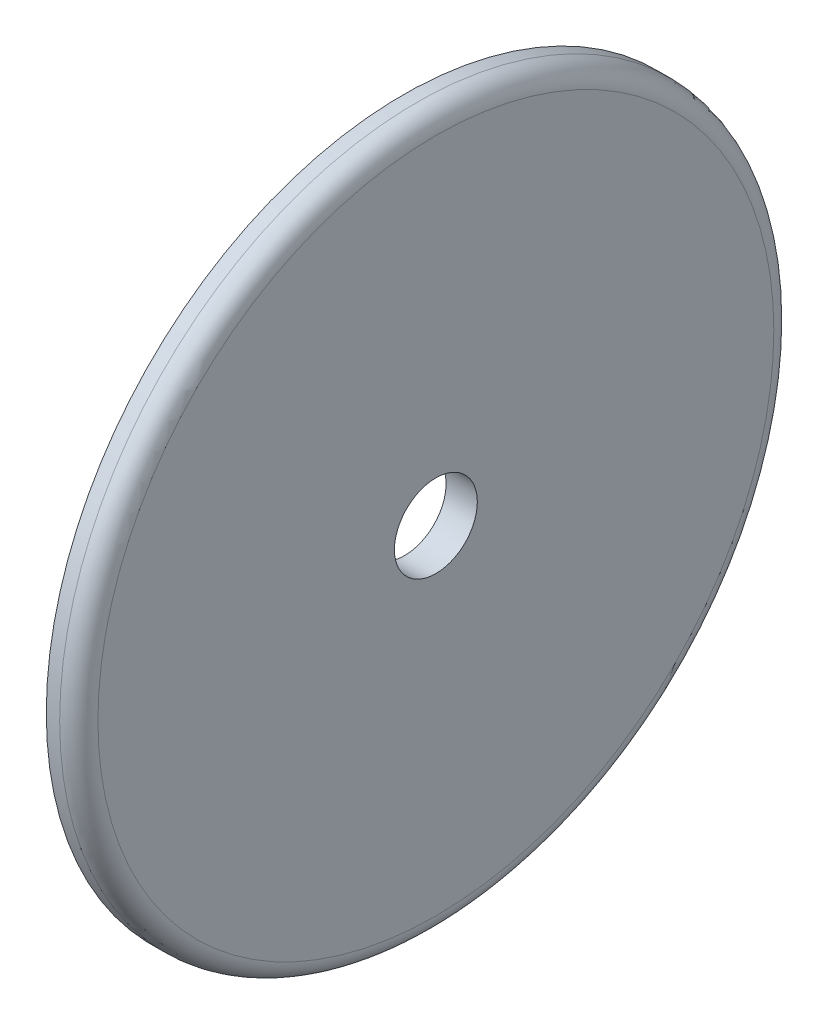
ISO-10303-21;
HEADER;
FILE_DESCRIPTION(('STEP AP214'),'2;1');
FILE_NAME('part.step','',(''),(''),'','','');
FILE_SCHEMA(('AUTOMOTIVE_DESIGN { 1 0 10303 214 1 1 1 1 }'));
ENDSEC;
DATA;
#1=APPLICATION_CONTEXT('core data for automotive mechanical design processes');
#2=APPLICATION_PROTOCOL_DEFINITION('international standard','automotive_design',2000,#1);
#3=PRODUCT_CONTEXT('',#1,'mechanical');
#4=PRODUCT('Part','Part','',(#3));
#5=PRODUCT_RELATED_PRODUCT_CATEGORY('part','',(#4));
#6=PRODUCT_DEFINITION_FORMATION('','',#4);
#7=PRODUCT_DEFINITION_CONTEXT('part definition',#1,'design');
#8=PRODUCT_DEFINITION('design','',#6,#7);
#9=PRODUCT_DEFINITION_SHAPE('','',#8);
#10=(LENGTH_UNIT() NAMED_UNIT(*) SI_UNIT(.MILLI.,.METRE.));
#11=(NAMED_UNIT(*) PLANE_ANGLE_UNIT() SI_UNIT($,.RADIAN.));
#12=(NAMED_UNIT(*) SI_UNIT($,.STERADIAN.) SOLID_ANGLE_UNIT());
#13=UNCERTAINTY_MEASURE_WITH_UNIT(LENGTH_MEASURE(1.E-05),#10,'distance_accuracy_value','');
#14=(GEOMETRIC_REPRESENTATION_CONTEXT(3) GLOBAL_UNCERTAINTY_ASSIGNED_CONTEXT((#13)) GLOBAL_UNIT_ASSIGNED_CONTEXT((#10,
#11,#12)) REPRESENTATION_CONTEXT('',''));
#15=CARTESIAN_POINT('',(0.,0.,0.));
#16=DIRECTION('',(0.,0.,1.));
#17=DIRECTION('',(1.,0.,0.));
#18=AXIS2_PLACEMENT_3D('',#15,#16,#17);
#19=CARTESIAN_POINT('',(-10.3336109897367,9.98012779545501,22.6661467783324));
#20=DIRECTION('',(-1.,0.,0.));
#21=DIRECTION('',(0.,0.,1.));
#22=AXIS2_PLACEMENT_3D('',#19,#20,#21);
#23=CYLINDRICAL_SURFACE('',#22,3.25);
#24=CARTESIAN_POINT('',(-46.6336109897367,9.98012779545501,22.6661467783324));
#25=DIRECTION('',(-1.,0.,0.));
#26=DIRECTION('',(0.,0.,1.));
#27=AXIS2_PLACEMENT_3D('',#24,#25,#26);
#28=CIRCLE('',#27,3.25);
#29=CARTESIAN_POINT('',(-46.6336109897367,9.98012779545501,25.9161467783324));
#30=VERTEX_POINT('',#29);
#31=EDGE_CURVE('E62',#30,#30,#28,.T.);
#32=ORIENTED_EDGE('',*,*,#31,.T.);
#33=EDGE_LOOP('',(#32));
#34=FACE_BOUND('',#33,.T.);
#35=CARTESIAN_POINT('',(-44.1836109897367,9.98012779545501,22.6661467783324));
#36=DIRECTION('',(1.,0.,0.));
#37=DIRECTION('',(0.,0.,-1.));
#38=AXIS2_PLACEMENT_3D('',#35,#36,#37);
#39=CIRCLE('',#38,3.25);
#40=CARTESIAN_POINT('',(-44.1836109897367,9.98012779545501,19.4161467783324));
#41=VERTEX_POINT('',#40);
#42=EDGE_CURVE('E37',#41,#41,#39,.F.);
#43=ORIENTED_EDGE('',*,*,#42,.F.);
#44=EDGE_LOOP('',(#43));
#45=FACE_BOUND('',#44,.T.);
#46=ADVANCED_FACE('F33',(#34,#45),#23,.F.);
#47=CARTESIAN_POINT('',(-46.7336109897367,9.98012779545501,22.6661467783324));
#48=DIRECTION('',(1.,0.,0.));
#49=DIRECTION('',(0.,0.,-1.));
#50=AXIS2_PLACEMENT_3D('',#47,#48,#49);
#51=CYLINDRICAL_SURFACE('',#50,28.);
#52=CARTESIAN_POINT('',(-45.6836109897367,9.98012779545501,22.6661467783324));
#53=DIRECTION('',(-1.,0.,0.));
#54=DIRECTION('',(0.,0.,1.));
#55=AXIS2_PLACEMENT_3D('',#52,#53,#54);
#56=CIRCLE('',#55,28.);
#57=CARTESIAN_POINT('',(-45.6836109897367,9.98012779545501,50.6661467783324));
#58=VERTEX_POINT('',#57);
#59=EDGE_CURVE('E53',#58,#58,#56,.T.);
#60=ORIENTED_EDGE('',*,*,#59,.T.);
#61=EDGE_LOOP('',(#60));
#62=FACE_BOUND('',#61,.T.);
#63=CARTESIAN_POINT('',(-46.7336109897367,9.98012779545501,22.6661467783324));
#64=DIRECTION('',(-1.,0.,0.));
#65=DIRECTION('',(0.,0.,1.));
#66=AXIS2_PLACEMENT_3D('',#63,#64,#65);
#67=CIRCLE('',#66,28.);
#68=CARTESIAN_POINT('',(-46.7336109897367,9.98012779545501,50.6661467783324));
#69=VERTEX_POINT('',#68);
#70=EDGE_CURVE('E56',#69,#69,#67,.T.);
#71=ORIENTED_EDGE('',*,*,#70,.F.);
#72=EDGE_LOOP('',(#71));
#73=FACE_BOUND('',#72,.T.);
#74=ADVANCED_FACE('F72',(#62,#73),#51,.T.);
#75=CARTESIAN_POINT('',(-46.7336109897367,9.98012779545501,22.6661467783324));
#76=DIRECTION('',(-1.,0.,0.));
#77=DIRECTION('',(0.,0.,1.));
#78=AXIS2_PLACEMENT_3D('',#75,#76,#77);
#79=PLANE('',#78);
#80=CARTESIAN_POINT('',(-46.7336109897367,9.98012779545501,22.6661467783324));
#81=DIRECTION('',(-1.,0.,0.));
#82=DIRECTION('',(0.,0.,1.));
#83=AXIS2_PLACEMENT_3D('',#80,#81,#82);
#84=CIRCLE('',#83,27.25);
#85=CARTESIAN_POINT('',(-46.7336109897367,9.98012779545501,49.9161467783324));
#86=VERTEX_POINT('',#85);
#87=EDGE_CURVE('E45',#86,#86,#84,.F.);
#88=ORIENTED_EDGE('',*,*,#87,.T.);
#89=EDGE_LOOP('',(#88));
#90=FACE_BOUND('',#89,.T.);
#91=ORIENTED_EDGE('',*,*,#70,.T.);
#92=EDGE_LOOP('',(#91));
#93=FACE_BOUND('',#92,.T.);
#94=ADVANCED_FACE('F79',(#90,#93),#79,.T.);
#95=CARTESIAN_POINT('',(-44.1836109897367,9.98012779545501,22.6661467783324));
#96=DIRECTION('',(-1.,0.,0.));
#97=DIRECTION('',(0.,0.,1.));
#98=AXIS2_PLACEMENT_3D('',#95,#96,#97);
#99=PLANE('',#98);
#100=CARTESIAN_POINT('',(-44.1836109897367,9.98012779545501,22.6661467783324));
#101=DIRECTION('',(-1.,0.,0.));
#102=DIRECTION('',(0.,0.,1.));
#103=AXIS2_PLACEMENT_3D('',#100,#101,#102);
#104=CIRCLE('',#103,26.5);
#105=CARTESIAN_POINT('',(-44.1836109897367,9.98012779545501,49.1661467783324));
#106=VERTEX_POINT('',#105);
#107=EDGE_CURVE('E50',#106,#106,#104,.F.);
#108=ORIENTED_EDGE('',*,*,#107,.T.);
#109=EDGE_LOOP('',(#108));
#110=FACE_BOUND('',#109,.T.);
#111=ORIENTED_EDGE('',*,*,#42,.T.);
#112=EDGE_LOOP('',(#111));
#113=FACE_BOUND('',#112,.T.);
#114=ADVANCED_FACE('F69',(#110,#113),#99,.F.);
#115=CARTESIAN_POINT('',(-45.6836109897367,9.98012779545501,22.6661467783324));
#116=DIRECTION('',(-1.,0.,0.));
#117=DIRECTION('',(0.,0.,1.));
#118=AXIS2_PLACEMENT_3D('',#115,#116,#117);
#119=TOROIDAL_SURFACE('',#118,26.5,1.5);
#120=ORIENTED_EDGE('',*,*,#107,.F.);
#121=EDGE_LOOP('',(#120));
#122=FACE_BOUND('',#121,.T.);
#123=ORIENTED_EDGE('',*,*,#59,.F.);
#124=EDGE_LOOP('',(#123));
#125=FACE_BOUND('',#124,.T.);
#126=ADVANCED_FACE('F90',(#122,#125),#119,.T.);
#127=CARTESIAN_POINT('',(-46.2336109897367,9.98012779545501,22.6661467783324));
#128=DIRECTION('',(-1.,0.,0.));
#129=DIRECTION('',(0.,0.,1.));
#130=AXIS2_PLACEMENT_3D('',#127,#128,#129);
#131=PLANE('',#130);
#132=CARTESIAN_POINT('',(-46.2336109897367,9.98012779545501,22.6661467783324));
#133=DIRECTION('',(-1.,0.,0.));
#134=DIRECTION('',(0.,0.,1.));
#135=AXIS2_PLACEMENT_3D('',#132,#133,#134);
#136=CIRCLE('',#135,22.);
#137=CARTESIAN_POINT('',(-46.2336109897367,9.98012779545501,44.6661467783324));
#138=VERTEX_POINT('',#137);
#139=EDGE_CURVE('E59',#138,#138,#136,.T.);
#140=ORIENTED_EDGE('',*,*,#139,.F.);
#141=EDGE_LOOP('',(#140));
#142=FACE_BOUND('',#141,.T.);
#143=CARTESIAN_POINT('',(-46.2336109897367,9.98012779545501,22.6661467783324));
#144=DIRECTION('',(-1.,0.,0.));
#145=DIRECTION('',(0.,0.,1.));
#146=AXIS2_PLACEMENT_3D('',#143,#144,#145);
#147=CIRCLE('',#146,24.4143590901913);
#148=CARTESIAN_POINT('',(-46.2336109897367,9.98012779545501,47.0805058685236));
#149=VERTEX_POINT('',#148);
#150=EDGE_CURVE('E41',#149,#149,#147,.T.);
#151=ORIENTED_EDGE('',*,*,#150,.T.);
#152=EDGE_LOOP('',(#151));
#153=FACE_BOUND('',#152,.T.);
#154=ADVANCED_FACE('F87',(#142,#153),#131,.T.);
#155=CARTESIAN_POINT('',(-46.2046300476113,9.98012779545501,22.6661467783324));
#156=DIRECTION('',(-1.,0.,0.));
#157=DIRECTION('',(0.,0.,1.));
#158=AXIS2_PLACEMENT_3D('',#155,#156,#157);
#159=CONICAL_SURFACE('',#158,24.25,1.39626340159546);
#160=ORIENTED_EDGE('',*,*,#87,.F.);
#161=EDGE_LOOP('',(#160));
#162=FACE_BOUND('',#161,.T.);
#163=ORIENTED_EDGE('',*,*,#150,.F.);
#164=EDGE_LOOP('',(#163));
#165=FACE_BOUND('',#164,.T.);
#166=ADVANCED_FACE('F86',(#162,#165),#159,.F.);
#167=CARTESIAN_POINT('',(-46.6336109897367,9.98012779545501,22.6661467783324));
#168=DIRECTION('',(-1.,0.,0.));
#169=DIRECTION('',(0.,0.,1.));
#170=AXIS2_PLACEMENT_3D('',#167,#168,#169);
#171=PLANE('',#170);
#172=CARTESIAN_POINT('',(-46.6336109897367,9.98012779545501,22.6661467783324));
#173=DIRECTION('',(-1.,0.,0.));
#174=DIRECTION('',(0.,0.,1.));
#175=AXIS2_PLACEMENT_3D('',#172,#173,#174);
#176=CIRCLE('',#175,19.2);
#177=CARTESIAN_POINT('',(-46.6336109897367,9.98012779545501,41.8661467783324));
#178=VERTEX_POINT('',#177);
#179=EDGE_CURVE('E10',#178,#178,#176,.T.);
#180=ORIENTED_EDGE('',*,*,#179,.T.);
#181=EDGE_LOOP('',(#180));
#182=FACE_BOUND('',#181,.T.);
#183=ORIENTED_EDGE('',*,*,#31,.F.);
#184=EDGE_LOOP('',(#183));
#185=FACE_BOUND('',#184,.T.);
#186=ADVANCED_FACE('F83',(#182,#185),#171,.T.);
#187=CARTESIAN_POINT('',(-36.6336109897367,9.98012779545501,22.6661467783324));
#188=DIRECTION('',(1.,0.,0.));
#189=DIRECTION('',(0.,0.,-1.));
#190=AXIS2_PLACEMENT_3D('',#187,#188,#189);
#191=TOROIDAL_SURFACE('',#190,19.2,10.);
#192=ORIENTED_EDGE('',*,*,#139,.T.);
#193=EDGE_LOOP('',(#192));
#194=FACE_BOUND('',#193,.T.);
#195=ORIENTED_EDGE('',*,*,#179,.F.);
#196=EDGE_LOOP('',(#195));
#197=FACE_BOUND('',#196,.T.);
#198=ADVANCED_FACE('F35',(#194,#197),#191,.T.);
#199=CLOSED_SHELL('',(#46,#74,#94,#114,#126,#154,#166,#186,#198));
#200=MANIFOLD_SOLID_BREP('B2',#199);
#201=ADVANCED_BREP_SHAPE_REPRESENTATION('',(#18,#200),#14);
#202=SHAPE_DEFINITION_REPRESENTATION(#9,#201);
ENDSEC;
END-ISO-10303-21;
